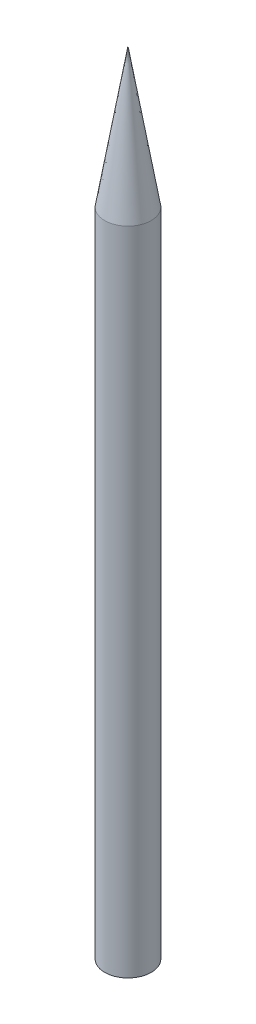
ISO-10303-21;
HEADER;
FILE_DESCRIPTION(('STEP AP214'),'2;1');
FILE_NAME('part.step','',(''),(''),'','','');
FILE_SCHEMA(('AUTOMOTIVE_DESIGN { 1 0 10303 214 1 1 1 1 }'));
ENDSEC;
DATA;
#1=APPLICATION_CONTEXT('core data for automotive mechanical design processes');
#2=APPLICATION_PROTOCOL_DEFINITION('international standard','automotive_design',2000,#1);
#3=PRODUCT_CONTEXT('',#1,'mechanical');
#4=PRODUCT('Part','Part','',(#3));
#5=PRODUCT_RELATED_PRODUCT_CATEGORY('part','',(#4));
#6=PRODUCT_DEFINITION_FORMATION('','',#4);
#7=PRODUCT_DEFINITION_CONTEXT('part definition',#1,'design');
#8=PRODUCT_DEFINITION('design','',#6,#7);
#9=PRODUCT_DEFINITION_SHAPE('','',#8);
#10=(LENGTH_UNIT() NAMED_UNIT(*) SI_UNIT(.MILLI.,.METRE.));
#11=(NAMED_UNIT(*) PLANE_ANGLE_UNIT() SI_UNIT($,.RADIAN.));
#12=(NAMED_UNIT(*) SI_UNIT($,.STERADIAN.) SOLID_ANGLE_UNIT());
#13=UNCERTAINTY_MEASURE_WITH_UNIT(LENGTH_MEASURE(1.E-05),#10,'distance_accuracy_value','');
#14=(GEOMETRIC_REPRESENTATION_CONTEXT(3) GLOBAL_UNCERTAINTY_ASSIGNED_CONTEXT((#13)) GLOBAL_UNIT_ASSIGNED_CONTEXT((#10,
#11,#12)) REPRESENTATION_CONTEXT('',''));
#15=CARTESIAN_POINT('',(0.,0.,0.));
#16=DIRECTION('',(0.,0.,1.));
#17=DIRECTION('',(1.,0.,0.));
#18=AXIS2_PLACEMENT_3D('',#15,#16,#17);
#19=CARTESIAN_POINT('',(0.,88.9,0.));
#20=DIRECTION('',(0.,-1.,0.));
#21=DIRECTION('',(0.,0.,-1.));
#22=AXIS2_PLACEMENT_3D('',#19,#20,#21);
#23=CYLINDRICAL_SURFACE('',#22,3.175);
#24=CARTESIAN_POINT('',(0.,88.9,0.));
#25=DIRECTION('',(0.,1.,0.));
#26=DIRECTION('',(0.,0.,1.));
#27=AXIS2_PLACEMENT_3D('',#24,#25,#26);
#28=CIRCLE('',#27,3.175);
#29=CARTESIAN_POINT('',(0.,88.9,3.175));
#30=VERTEX_POINT('',#29);
#31=EDGE_CURVE('E11',#30,#30,#28,.T.);
#32=ORIENTED_EDGE('',*,*,#31,.F.);
#33=EDGE_LOOP('',(#32));
#34=FACE_BOUND('',#33,.T.);
#35=CARTESIAN_POINT('',(0.,0.,0.));
#36=DIRECTION('',(0.,1.,0.));
#37=DIRECTION('',(0.,0.,1.));
#38=AXIS2_PLACEMENT_3D('',#35,#36,#37);
#39=CIRCLE('',#38,3.175);
#40=CARTESIAN_POINT('',(0.,0.,3.175));
#41=VERTEX_POINT('',#40);
#42=EDGE_CURVE('E36',#41,#41,#39,.T.);
#43=ORIENTED_EDGE('',*,*,#42,.T.);
#44=EDGE_LOOP('',(#43));
#45=FACE_BOUND('',#44,.T.);
#46=ADVANCED_FACE('F33',(#34,#45),#23,.T.);
#47=CARTESIAN_POINT('',(0.,0.,0.));
#48=DIRECTION('',(0.,1.,0.));
#49=DIRECTION('',(0.,0.,1.));
#50=AXIS2_PLACEMENT_3D('',#47,#48,#49);
#51=PLANE('',#50);
#52=ORIENTED_EDGE('',*,*,#42,.F.);
#53=EDGE_LOOP('',(#52));
#54=FACE_BOUND('',#53,.T.);
#55=ADVANCED_FACE('F44',(#54),#51,.F.);
#56=CARTESIAN_POINT('',(0.,107.95,0.));
#57=DIRECTION('',(0.,-1.,0.));
#58=DIRECTION('',(0.,0.,-1.));
#59=AXIS2_PLACEMENT_3D('',#56,#57,#58);
#60=CONICAL_SURFACE('',#59,0.,0.165148677414627);
#61=ORIENTED_EDGE('',*,*,#31,.T.);
#62=EDGE_LOOP('',(#61));
#63=FACE_BOUND('',#62,.T.);
#64=CARTESIAN_POINT('',(0.,107.95,0.));
#65=VERTEX_POINT('',#64);
#66=VERTEX_LOOP('',#65);
#67=FACE_BOUND('',#66,.T.);
#68=ADVANCED_FACE('F42',(#63,#67),#60,.T.);
#69=CLOSED_SHELL('',(#46,#55,#68));
#70=MANIFOLD_SOLID_BREP('B2',#69);
#71=ADVANCED_BREP_SHAPE_REPRESENTATION('',(#18,#70),#14);
#72=SHAPE_DEFINITION_REPRESENTATION(#9,#71);
ENDSEC;
END-ISO-10303-21;
